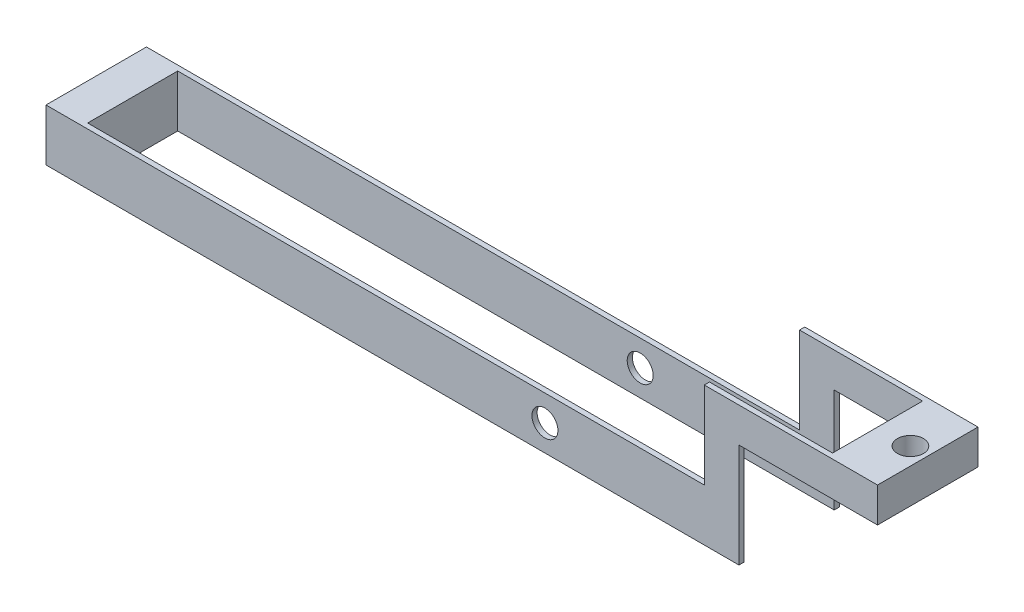
ISO-10303-21;
HEADER;
FILE_DESCRIPTION(('STEP AP214'),'2;1');
FILE_NAME('part.step','',(''),(''),'','','');
FILE_SCHEMA(('AUTOMOTIVE_DESIGN { 1 0 10303 214 1 1 1 1 }'));
ENDSEC;
DATA;
#1=APPLICATION_CONTEXT('core data for automotive mechanical design processes');
#2=APPLICATION_PROTOCOL_DEFINITION('international standard','automotive_design',2000,#1);
#3=PRODUCT_CONTEXT('',#1,'mechanical');
#4=PRODUCT('Part','Part','',(#3));
#5=PRODUCT_RELATED_PRODUCT_CATEGORY('part','',(#4));
#6=PRODUCT_DEFINITION_FORMATION('','',#4);
#7=PRODUCT_DEFINITION_CONTEXT('part definition',#1,'design');
#8=PRODUCT_DEFINITION('design','',#6,#7);
#9=PRODUCT_DEFINITION_SHAPE('','',#8);
#10=(LENGTH_UNIT() NAMED_UNIT(*) SI_UNIT(.MILLI.,.METRE.));
#11=(NAMED_UNIT(*) PLANE_ANGLE_UNIT() SI_UNIT($,.RADIAN.));
#12=(NAMED_UNIT(*) SI_UNIT($,.STERADIAN.) SOLID_ANGLE_UNIT());
#13=UNCERTAINTY_MEASURE_WITH_UNIT(LENGTH_MEASURE(1.E-05),#10,'distance_accuracy_value','');
#14=(GEOMETRIC_REPRESENTATION_CONTEXT(3) GLOBAL_UNCERTAINTY_ASSIGNED_CONTEXT((#13)) GLOBAL_UNIT_ASSIGNED_CONTEXT((#10,
#11,#12)) REPRESENTATION_CONTEXT('',''));
#15=CARTESIAN_POINT('',(0.,0.,0.));
#16=DIRECTION('',(0.,0.,1.));
#17=DIRECTION('',(1.,0.,0.));
#18=AXIS2_PLACEMENT_3D('',#15,#16,#17);
#19=CARTESIAN_POINT('',(241.3,0.,36.83));
#20=DIRECTION('',(-1.,0.,0.));
#21=DIRECTION('',(0.,0.,1.));
#22=AXIS2_PLACEMENT_3D('',#19,#20,#21);
#23=PLANE('',#22);
#24=DIRECTION('',(0.,1.,0.));
#25=VECTOR('',#24,1.);
#26=CARTESIAN_POINT('',(241.3,0.,34.925));
#27=LINE('',#26,#25);
#28=CARTESIAN_POINT('',(241.3,19.05,34.925));
#29=VERTEX_POINT('',#28);
#30=CARTESIAN_POINT('',(241.3,50.8,34.925));
#31=VERTEX_POINT('',#30);
#32=EDGE_CURVE('E202',#29,#31,#27,.T.);
#33=ORIENTED_EDGE('',*,*,#32,.F.);
#34=DIRECTION('',(0.,0.,-1.));
#35=VECTOR('',#34,1.);
#36=CARTESIAN_POINT('',(241.3,19.05,36.83));
#37=LINE('',#36,#35);
#38=CARTESIAN_POINT('',(241.3,19.05,36.83));
#39=VERTEX_POINT('',#38);
#40=EDGE_CURVE('E271',#39,#29,#37,.T.);
#41=ORIENTED_EDGE('',*,*,#40,.F.);
#42=DIRECTION('',(0.,1.,0.));
#43=VECTOR('',#42,1.);
#44=CARTESIAN_POINT('',(241.3,0.,36.83));
#45=LINE('',#44,#43);
#46=CARTESIAN_POINT('',(241.3,50.8,36.83));
#47=VERTEX_POINT('',#46);
#48=EDGE_CURVE('E216',#39,#47,#45,.T.);
#49=ORIENTED_EDGE('',*,*,#48,.T.);
#50=DIRECTION('',(0.,0.,-1.));
#51=VECTOR('',#50,1.);
#52=CARTESIAN_POINT('',(241.3,50.8,36.83));
#53=LINE('',#52,#51);
#54=EDGE_CURVE('E274',#47,#31,#53,.T.);
#55=ORIENTED_EDGE('',*,*,#54,.T.);
#56=EDGE_LOOP('',(#33,#41,#49,#55));
#57=FACE_BOUND('',#56,.T.);
#58=ADVANCED_FACE('F35',(#57),#23,.T.);
#59=CARTESIAN_POINT('',(254.,0.,36.83));
#60=DIRECTION('',(1.,0.,0.));
#61=DIRECTION('',(0.,0.,-1.));
#62=AXIS2_PLACEMENT_3D('',#59,#60,#61);
#63=PLANE('',#62);
#64=DIRECTION('',(0.,-1.,0.));
#65=VECTOR('',#64,1.);
#66=CARTESIAN_POINT('',(254.,0.,34.925));
#67=LINE('',#66,#65);
#68=CARTESIAN_POINT('',(254.,38.1,34.925));
#69=VERTEX_POINT('',#68);
#70=CARTESIAN_POINT('',(254.,0.,34.925));
#71=VERTEX_POINT('',#70);
#72=EDGE_CURVE('E195',#69,#71,#67,.T.);
#73=ORIENTED_EDGE('',*,*,#72,.F.);
#74=DIRECTION('',(0.,0.,-1.));
#75=VECTOR('',#74,1.);
#76=CARTESIAN_POINT('',(254.,38.1,36.83));
#77=LINE('',#76,#75);
#78=CARTESIAN_POINT('',(254.,38.1,36.83));
#79=VERTEX_POINT('',#78);
#80=EDGE_CURVE('E259',#79,#69,#77,.T.);
#81=ORIENTED_EDGE('',*,*,#80,.F.);
#82=DIRECTION('',(0.,-1.,0.));
#83=VECTOR('',#82,1.);
#84=CARTESIAN_POINT('',(254.,0.,36.83));
#85=LINE('',#84,#83);
#86=CARTESIAN_POINT('',(254.,0.,36.83));
#87=VERTEX_POINT('',#86);
#88=EDGE_CURVE('E227',#79,#87,#85,.T.);
#89=ORIENTED_EDGE('',*,*,#88,.T.);
#90=DIRECTION('',(0.,0.,-1.));
#91=VECTOR('',#90,1.);
#92=CARTESIAN_POINT('',(254.,0.,36.83));
#93=LINE('',#92,#91);
#94=EDGE_CURVE('E263',#87,#71,#93,.T.);
#95=ORIENTED_EDGE('',*,*,#94,.T.);
#96=EDGE_LOOP('',(#73,#81,#89,#95));
#97=FACE_BOUND('',#96,.T.);
#98=ADVANCED_FACE('F312',(#97),#63,.T.);
#99=CARTESIAN_POINT('',(182.88,9.525,36.83));
#100=DIRECTION('',(0.,0.,-1.));
#101=DIRECTION('',(-1.,0.,0.));
#102=AXIS2_PLACEMENT_3D('',#99,#100,#101);
#103=CYLINDRICAL_SURFACE('',#102,4.76250000000001);
#104=CARTESIAN_POINT('',(182.88,9.525,34.925));
#105=DIRECTION('',(0.,0.,1.));
#106=DIRECTION('',(1.,0.,0.));
#107=AXIS2_PLACEMENT_3D('',#104,#105,#106);
#108=CIRCLE('',#107,4.76250000000001);
#109=CARTESIAN_POINT('',(187.6425,9.525,34.925));
#110=VERTEX_POINT('',#109);
#111=EDGE_CURVE('E197',#110,#110,#108,.T.);
#112=ORIENTED_EDGE('',*,*,#111,.F.);
#113=EDGE_LOOP('',(#112));
#114=FACE_BOUND('',#113,.T.);
#115=CARTESIAN_POINT('',(182.88,9.525,36.83));
#116=DIRECTION('',(0.,0.,1.));
#117=DIRECTION('',(1.,0.,0.));
#118=AXIS2_PLACEMENT_3D('',#115,#116,#117);
#119=CIRCLE('',#118,4.76250000000001);
#120=CARTESIAN_POINT('',(187.6425,9.525,36.83));
#121=VERTEX_POINT('',#120);
#122=EDGE_CURVE('E207',#121,#121,#119,.T.);
#123=ORIENTED_EDGE('',*,*,#122,.T.);
#124=EDGE_LOOP('',(#123));
#125=FACE_BOUND('',#124,.T.);
#126=ADVANCED_FACE('F344',(#114,#125),#103,.F.);
#127=CARTESIAN_POINT('',(304.8,0.,36.83));
#128=DIRECTION('',(1.,0.,0.));
#129=DIRECTION('',(0.,0.,-1.));
#130=AXIS2_PLACEMENT_3D('',#127,#128,#129);
#131=PLANE('',#130);
#132=DIRECTION('',(0.,-1.,0.));
#133=VECTOR('',#132,1.);
#134=CARTESIAN_POINT('',(304.8,0.,0.));
#135=LINE('',#134,#133);
#136=CARTESIAN_POINT('',(304.8,50.8,0.));
#137=VERTEX_POINT('',#136);
#138=CARTESIAN_POINT('',(304.8,38.1,0.));
#139=VERTEX_POINT('',#138);
#140=EDGE_CURVE('E235',#137,#139,#135,.T.);
#141=ORIENTED_EDGE('',*,*,#140,.F.);
#142=DIRECTION('',(0.,0.,-1.));
#143=VECTOR('',#142,1.);
#144=CARTESIAN_POINT('',(304.8,50.8,36.83));
#145=LINE('',#144,#143);
#146=CARTESIAN_POINT('',(304.8,50.8,36.83));
#147=VERTEX_POINT('',#146);
#148=EDGE_CURVE('E277',#147,#137,#145,.T.);
#149=ORIENTED_EDGE('',*,*,#148,.F.);
#150=DIRECTION('',(0.,-1.,0.));
#151=VECTOR('',#150,1.);
#152=CARTESIAN_POINT('',(304.8,0.,36.83));
#153=LINE('',#152,#151);
#154=CARTESIAN_POINT('',(304.8,38.1,36.83));
#155=VERTEX_POINT('',#154);
#156=EDGE_CURVE('E210',#147,#155,#153,.T.);
#157=ORIENTED_EDGE('',*,*,#156,.T.);
#158=DIRECTION('',(0.,0.,-1.));
#159=VECTOR('',#158,1.);
#160=CARTESIAN_POINT('',(304.8,38.1,36.83));
#161=LINE('',#160,#159);
#162=EDGE_CURVE('E232',#155,#139,#161,.T.);
#163=ORIENTED_EDGE('',*,*,#162,.T.);
#164=EDGE_LOOP('',(#141,#149,#157,#163));
#165=FACE_BOUND('',#164,.T.);
#166=ADVANCED_FACE('F317',(#165),#131,.T.);
#167=CARTESIAN_POINT('',(0.,50.8,36.83));
#168=DIRECTION('',(0.,-1.,0.));
#169=DIRECTION('',(1.,0.,0.));
#170=AXIS2_PLACEMENT_3D('',#167,#168,#169);
#171=PLANE('',#170);
#172=CARTESIAN_POINT('',(298.45,50.8,18.415));
#173=DIRECTION('',(0.,1.,0.));
#174=DIRECTION('',(0.,0.,1.));
#175=AXIS2_PLACEMENT_3D('',#172,#173,#174);
#176=CIRCLE('',#175,4.76250000000001);
#177=CARTESIAN_POINT('',(298.45,50.8,23.1775));
#178=VERTEX_POINT('',#177);
#179=EDGE_CURVE('E177',#178,#178,#176,.T.);
#180=ORIENTED_EDGE('',*,*,#179,.F.);
#181=EDGE_LOOP('',(#180));
#182=FACE_BOUND('',#181,.T.);
#183=DIRECTION('',(0.,0.,1.));
#184=VECTOR('',#183,1.);
#185=CARTESIAN_POINT('',(286.401052357656,50.8,34.925));
#186=LINE('',#185,#184);
#187=CARTESIAN_POINT('',(286.401052357656,50.8,1.905));
#188=VERTEX_POINT('',#187);
#189=CARTESIAN_POINT('',(286.401052357656,50.8,34.925));
#190=VERTEX_POINT('',#189);
#191=EDGE_CURVE('E159',#188,#190,#186,.T.);
#192=ORIENTED_EDGE('',*,*,#191,.T.);
#193=DIRECTION('',(-1.,0.,0.));
#194=VECTOR('',#193,1.);
#195=CARTESIAN_POINT('',(13.3510523576561,50.8,34.925));
#196=LINE('',#195,#194);
#197=EDGE_CURVE('E165',#190,#31,#196,.T.);
#198=ORIENTED_EDGE('',*,*,#197,.T.);
#199=ORIENTED_EDGE('',*,*,#54,.F.);
#200=DIRECTION('',(-1.,0.,0.));
#201=VECTOR('',#200,1.);
#202=CARTESIAN_POINT('',(0.,50.8,36.83));
#203=LINE('',#202,#201);
#204=EDGE_CURVE('E214',#147,#47,#203,.T.);
#205=ORIENTED_EDGE('',*,*,#204,.F.);
#206=ORIENTED_EDGE('',*,*,#148,.T.);
#207=DIRECTION('',(-1.,0.,0.));
#208=VECTOR('',#207,1.);
#209=CARTESIAN_POINT('',(0.,50.8,0.));
#210=LINE('',#209,#208);
#211=CARTESIAN_POINT('',(241.3,50.8,0.));
#212=VERTEX_POINT('',#211);
#213=EDGE_CURVE('E238',#137,#212,#210,.T.);
#214=ORIENTED_EDGE('',*,*,#213,.T.);
#215=CARTESIAN_POINT('',(241.3,50.8,1.905));
#216=VERTEX_POINT('',#215);
#217=EDGE_CURVE('E170',#216,#212,#53,.T.);
#218=ORIENTED_EDGE('',*,*,#217,.F.);
#219=DIRECTION('',(1.,0.,0.));
#220=VECTOR('',#219,1.);
#221=CARTESIAN_POINT('',(13.3510523576561,50.8,1.905));
#222=LINE('',#221,#220);
#223=EDGE_CURVE('E151',#216,#188,#222,.T.);
#224=ORIENTED_EDGE('',*,*,#223,.T.);
#225=EDGE_LOOP('',(#192,#198,#199,#205,#206,#214,#218,#224));
#226=FACE_BOUND('',#225,.T.);
#227=ADVANCED_FACE('F168',(#182,#226),#171,.F.);
#228=DIRECTION('',(0.,-1.,0.));
#229=VECTOR('',#228,1.);
#230=CARTESIAN_POINT('',(241.3,0.,1.905));
#231=LINE('',#230,#229);
#232=CARTESIAN_POINT('',(241.3,19.05,1.905));
#233=VERTEX_POINT('',#232);
#234=EDGE_CURVE('E51',#216,#233,#231,.T.);
#235=ORIENTED_EDGE('',*,*,#234,.F.);
#236=ORIENTED_EDGE('',*,*,#217,.T.);
#237=DIRECTION('',(0.,1.,0.));
#238=VECTOR('',#237,1.);
#239=CARTESIAN_POINT('',(241.3,0.,0.));
#240=LINE('',#239,#238);
#241=CARTESIAN_POINT('',(241.3,19.05,0.));
#242=VERTEX_POINT('',#241);
#243=EDGE_CURVE('E240',#242,#212,#240,.T.);
#244=ORIENTED_EDGE('',*,*,#243,.F.);
#245=EDGE_CURVE('E270',#233,#242,#37,.T.);
#246=ORIENTED_EDGE('',*,*,#245,.F.);
#247=EDGE_LOOP('',(#235,#236,#244,#246));
#248=FACE_BOUND('',#247,.T.);
#249=ADVANCED_FACE('F325',(#248),#23,.T.);
#250=CARTESIAN_POINT('',(0.,19.05,36.83));
#251=DIRECTION('',(0.,1.,0.));
#252=DIRECTION('',(0.,0.,1.));
#253=AXIS2_PLACEMENT_3D('',#250,#251,#252);
#254=PLANE('',#253);
#255=DIRECTION('',(1.,0.,0.));
#256=VECTOR('',#255,1.);
#257=CARTESIAN_POINT('',(0.,19.05,34.925));
#258=LINE('',#257,#256);
#259=CARTESIAN_POINT('',(13.3510523576561,19.05,34.925));
#260=VERTEX_POINT('',#259);
#261=EDGE_CURVE('E200',#260,#29,#258,.T.);
#262=ORIENTED_EDGE('',*,*,#261,.F.);
#263=DIRECTION('',(0.,0.,1.));
#264=VECTOR('',#263,1.);
#265=CARTESIAN_POINT('',(13.3510523576561,19.05,36.83));
#266=LINE('',#265,#264);
#267=CARTESIAN_POINT('',(13.3510523576561,19.05,1.905));
#268=VERTEX_POINT('',#267);
#269=EDGE_CURVE('E204',#268,#260,#266,.T.);
#270=ORIENTED_EDGE('',*,*,#269,.F.);
#271=DIRECTION('',(-1.,0.,0.));
#272=VECTOR('',#271,1.);
#273=CARTESIAN_POINT('',(0.,19.05,1.905));
#274=LINE('',#273,#272);
#275=EDGE_CURVE('E192',#233,#268,#274,.T.);
#276=ORIENTED_EDGE('',*,*,#275,.F.);
#277=ORIENTED_EDGE('',*,*,#245,.T.);
#278=DIRECTION('',(1.,0.,0.));
#279=VECTOR('',#278,1.);
#280=CARTESIAN_POINT('',(0.,19.05,0.));
#281=LINE('',#280,#279);
#282=CARTESIAN_POINT('',(0.,19.05,0.));
#283=VERTEX_POINT('',#282);
#284=EDGE_CURVE('E243',#283,#242,#281,.T.);
#285=ORIENTED_EDGE('',*,*,#284,.F.);
#286=DIRECTION('',(0.,0.,-1.));
#287=VECTOR('',#286,1.);
#288=CARTESIAN_POINT('',(0.,19.05,36.83));
#289=LINE('',#288,#287);
#290=CARTESIAN_POINT('',(0.,19.05,36.83));
#291=VERTEX_POINT('',#290);
#292=EDGE_CURVE('E268',#291,#283,#289,.T.);
#293=ORIENTED_EDGE('',*,*,#292,.F.);
#294=DIRECTION('',(1.,0.,0.));
#295=VECTOR('',#294,1.);
#296=CARTESIAN_POINT('',(0.,19.05,36.83));
#297=LINE('',#296,#295);
#298=EDGE_CURVE('E219',#291,#39,#297,.T.);
#299=ORIENTED_EDGE('',*,*,#298,.T.);
#300=ORIENTED_EDGE('',*,*,#40,.T.);
#301=EDGE_LOOP('',(#262,#270,#276,#277,#285,#293,#299,#300));
#302=FACE_BOUND('',#301,.T.);
#303=ADVANCED_FACE('F299',(#302),#254,.T.);
#304=CARTESIAN_POINT('',(0.,0.,36.83));
#305=DIRECTION('',(-1.,0.,0.));
#306=DIRECTION('',(0.,0.,1.));
#307=AXIS2_PLACEMENT_3D('',#304,#305,#306);
#308=PLANE('',#307);
#309=DIRECTION('',(0.,1.,0.));
#310=VECTOR('',#309,1.);
#311=CARTESIAN_POINT('',(0.,0.,0.));
#312=LINE('',#311,#310);
#313=CARTESIAN_POINT('',(0.,0.,0.));
#314=VERTEX_POINT('',#313);
#315=EDGE_CURVE('E246',#314,#283,#312,.T.);
#316=ORIENTED_EDGE('',*,*,#315,.F.);
#317=DIRECTION('',(0.,0.,-1.));
#318=VECTOR('',#317,1.);
#319=CARTESIAN_POINT('',(0.,0.,36.83));
#320=LINE('',#319,#318);
#321=CARTESIAN_POINT('',(0.,0.,36.83));
#322=VERTEX_POINT('',#321);
#323=EDGE_CURVE('E266',#322,#314,#320,.T.);
#324=ORIENTED_EDGE('',*,*,#323,.F.);
#325=DIRECTION('',(0.,1.,0.));
#326=VECTOR('',#325,1.);
#327=CARTESIAN_POINT('',(0.,0.,36.83));
#328=LINE('',#327,#326);
#329=EDGE_CURVE('E222',#322,#291,#328,.T.);
#330=ORIENTED_EDGE('',*,*,#329,.T.);
#331=ORIENTED_EDGE('',*,*,#292,.T.);
#332=EDGE_LOOP('',(#316,#324,#330,#331));
#333=FACE_BOUND('',#332,.T.);
#334=ADVANCED_FACE('F303',(#333),#308,.T.);
#335=CARTESIAN_POINT('',(0.,0.,36.83));
#336=DIRECTION('',(0.,1.,0.));
#337=DIRECTION('',(0.,0.,1.));
#338=AXIS2_PLACEMENT_3D('',#335,#336,#337);
#339=PLANE('',#338);
#340=DIRECTION('',(0.,0.,-1.));
#341=VECTOR('',#340,1.);
#342=CARTESIAN_POINT('',(13.3510523576561,0.,34.925));
#343=LINE('',#342,#341);
#344=CARTESIAN_POINT('',(13.3510523576561,0.,34.925));
#345=VERTEX_POINT('',#344);
#346=CARTESIAN_POINT('',(13.3510523576561,0.,1.905));
#347=VERTEX_POINT('',#346);
#348=EDGE_CURVE('E180',#345,#347,#343,.T.);
#349=ORIENTED_EDGE('',*,*,#348,.F.);
#350=DIRECTION('',(-1.,0.,0.));
#351=VECTOR('',#350,1.);
#352=CARTESIAN_POINT('',(13.3510523576561,0.,34.925));
#353=LINE('',#352,#351);
#354=EDGE_CURVE('E171',#71,#345,#353,.T.);
#355=ORIENTED_EDGE('',*,*,#354,.F.);
#356=ORIENTED_EDGE('',*,*,#94,.F.);
#357=DIRECTION('',(1.,0.,0.));
#358=VECTOR('',#357,1.);
#359=CARTESIAN_POINT('',(0.,0.,36.83));
#360=LINE('',#359,#358);
#361=EDGE_CURVE('E225',#322,#87,#360,.T.);
#362=ORIENTED_EDGE('',*,*,#361,.F.);
#363=ORIENTED_EDGE('',*,*,#323,.T.);
#364=DIRECTION('',(1.,0.,0.));
#365=VECTOR('',#364,1.);
#366=CARTESIAN_POINT('',(0.,0.,0.));
#367=LINE('',#366,#365);
#368=CARTESIAN_POINT('',(254.,0.,0.));
#369=VERTEX_POINT('',#368);
#370=EDGE_CURVE('E249',#314,#369,#367,.T.);
#371=ORIENTED_EDGE('',*,*,#370,.T.);
#372=CARTESIAN_POINT('',(254.,0.,1.905));
#373=VERTEX_POINT('',#372);
#374=EDGE_CURVE('E262',#373,#369,#93,.T.);
#375=ORIENTED_EDGE('',*,*,#374,.F.);
#376=DIRECTION('',(1.,0.,0.));
#377=VECTOR('',#376,1.);
#378=CARTESIAN_POINT('',(13.3510523576561,0.,1.905));
#379=LINE('',#378,#377);
#380=EDGE_CURVE('E174',#347,#373,#379,.T.);
#381=ORIENTED_EDGE('',*,*,#380,.F.);
#382=EDGE_LOOP('',(#349,#355,#356,#362,#363,#371,#375,#381));
#383=FACE_BOUND('',#382,.T.);
#384=ADVANCED_FACE('F310',(#383),#339,.F.);
#385=DIRECTION('',(0.,1.,0.));
#386=VECTOR('',#385,1.);
#387=CARTESIAN_POINT('',(254.,0.,1.905));
#388=LINE('',#387,#386);
#389=CARTESIAN_POINT('',(254.,38.1,1.905));
#390=VERTEX_POINT('',#389);
#391=EDGE_CURVE('E58',#373,#390,#388,.T.);
#392=ORIENTED_EDGE('',*,*,#391,.F.);
#393=ORIENTED_EDGE('',*,*,#374,.T.);
#394=DIRECTION('',(0.,-1.,0.));
#395=VECTOR('',#394,1.);
#396=CARTESIAN_POINT('',(254.,0.,0.));
#397=LINE('',#396,#395);
#398=CARTESIAN_POINT('',(254.,38.1,0.));
#399=VERTEX_POINT('',#398);
#400=EDGE_CURVE('E252',#399,#369,#397,.T.);
#401=ORIENTED_EDGE('',*,*,#400,.F.);
#402=EDGE_CURVE('E258',#390,#399,#77,.T.);
#403=ORIENTED_EDGE('',*,*,#402,.F.);
#404=EDGE_LOOP('',(#392,#393,#401,#403));
#405=FACE_BOUND('',#404,.T.);
#406=ADVANCED_FACE('F334',(#405),#63,.T.);
#407=CARTESIAN_POINT('',(182.88,9.525,1.905));
#408=DIRECTION('',(0.,0.,-1.));
#409=DIRECTION('',(-1.,0.,0.));
#410=AXIS2_PLACEMENT_3D('',#407,#408,#409);
#411=CIRCLE('',#410,4.76250000000001);
#412=CARTESIAN_POINT('',(178.1175,9.525,1.905));
#413=VERTEX_POINT('',#412);
#414=EDGE_CURVE('E189',#413,#413,#411,.T.);
#415=ORIENTED_EDGE('',*,*,#414,.F.);
#416=EDGE_LOOP('',(#415));
#417=FACE_BOUND('',#416,.T.);
#418=CARTESIAN_POINT('',(182.88,9.525,0.));
#419=DIRECTION('',(0.,0.,1.));
#420=DIRECTION('',(1.,0.,0.));
#421=AXIS2_PLACEMENT_3D('',#418,#419,#420);
#422=CIRCLE('',#421,4.76250000000001);
#423=CARTESIAN_POINT('',(187.6425,9.525,0.));
#424=VERTEX_POINT('',#423);
#425=EDGE_CURVE('E206',#424,#424,#422,.T.);
#426=ORIENTED_EDGE('',*,*,#425,.F.);
#427=EDGE_LOOP('',(#426));
#428=FACE_BOUND('',#427,.T.);
#429=ADVANCED_FACE('F37',(#417,#428),#103,.F.);
#430=CARTESIAN_POINT('',(0.,38.1,36.83));
#431=DIRECTION('',(0.,1.,0.));
#432=DIRECTION('',(0.,0.,1.));
#433=AXIS2_PLACEMENT_3D('',#430,#431,#432);
#434=PLANE('',#433);
#435=CARTESIAN_POINT('',(298.45,38.1,18.415));
#436=DIRECTION('',(0.,1.,0.));
#437=DIRECTION('',(0.,0.,1.));
#438=AXIS2_PLACEMENT_3D('',#435,#436,#437);
#439=CIRCLE('',#438,4.76250000000001);
#440=CARTESIAN_POINT('',(298.45,38.1,23.1775));
#441=VERTEX_POINT('',#440);
#442=EDGE_CURVE('E39',#441,#441,#439,.T.);
#443=ORIENTED_EDGE('',*,*,#442,.T.);
#444=EDGE_LOOP('',(#443));
#445=FACE_BOUND('',#444,.T.);
#446=ORIENTED_EDGE('',*,*,#80,.T.);
#447=DIRECTION('',(1.,0.,0.));
#448=VECTOR('',#447,1.);
#449=CARTESIAN_POINT('',(0.,38.1,34.925));
#450=LINE('',#449,#448);
#451=CARTESIAN_POINT('',(286.401052357656,38.1,34.925));
#452=VERTEX_POINT('',#451);
#453=EDGE_CURVE('E11',#69,#452,#450,.T.);
#454=ORIENTED_EDGE('',*,*,#453,.T.);
#455=DIRECTION('',(0.,0.,-1.));
#456=VECTOR('',#455,1.);
#457=CARTESIAN_POINT('',(286.401052357656,38.1,36.83));
#458=LINE('',#457,#456);
#459=CARTESIAN_POINT('',(286.401052357656,38.1,1.905));
#460=VERTEX_POINT('',#459);
#461=EDGE_CURVE('E44',#452,#460,#458,.T.);
#462=ORIENTED_EDGE('',*,*,#461,.T.);
#463=DIRECTION('',(-1.,0.,0.));
#464=VECTOR('',#463,1.);
#465=CARTESIAN_POINT('',(0.,38.1,1.905));
#466=LINE('',#465,#464);
#467=EDGE_CURVE('E152',#460,#390,#466,.T.);
#468=ORIENTED_EDGE('',*,*,#467,.T.);
#469=ORIENTED_EDGE('',*,*,#402,.T.);
#470=DIRECTION('',(1.,0.,0.));
#471=VECTOR('',#470,1.);
#472=CARTESIAN_POINT('',(0.,38.1,0.));
#473=LINE('',#472,#471);
#474=EDGE_CURVE('E211',#399,#139,#473,.T.);
#475=ORIENTED_EDGE('',*,*,#474,.T.);
#476=ORIENTED_EDGE('',*,*,#162,.F.);
#477=DIRECTION('',(1.,0.,0.));
#478=VECTOR('',#477,1.);
#479=CARTESIAN_POINT('',(0.,38.1,36.83));
#480=LINE('',#479,#478);
#481=EDGE_CURVE('E230',#79,#155,#480,.T.);
#482=ORIENTED_EDGE('',*,*,#481,.F.);
#483=EDGE_LOOP('',(#446,#454,#462,#468,#469,#475,#476,#482));
#484=FACE_BOUND('',#483,.T.);
#485=ADVANCED_FACE('F281',(#445,#484),#434,.F.);
#486=CARTESIAN_POINT('',(0.,0.,36.83));
#487=DIRECTION('',(0.,0.,1.));
#488=DIRECTION('',(1.,0.,0.));
#489=AXIS2_PLACEMENT_3D('',#486,#487,#488);
#490=PLANE('',#489);
#491=ORIENTED_EDGE('',*,*,#122,.F.);
#492=EDGE_LOOP('',(#491));
#493=FACE_BOUND('',#492,.T.);
#494=ORIENTED_EDGE('',*,*,#156,.F.);
#495=ORIENTED_EDGE('',*,*,#204,.T.);
#496=ORIENTED_EDGE('',*,*,#48,.F.);
#497=ORIENTED_EDGE('',*,*,#298,.F.);
#498=ORIENTED_EDGE('',*,*,#329,.F.);
#499=ORIENTED_EDGE('',*,*,#361,.T.);
#500=ORIENTED_EDGE('',*,*,#88,.F.);
#501=ORIENTED_EDGE('',*,*,#481,.T.);
#502=EDGE_LOOP('',(#494,#495,#496,#497,#498,#499,#500,#501));
#503=FACE_BOUND('',#502,.T.);
#504=ADVANCED_FACE('F295',(#493,#503),#490,.T.);
#505=CARTESIAN_POINT('',(0.,0.,0.));
#506=DIRECTION('',(0.,0.,1.));
#507=DIRECTION('',(1.,0.,0.));
#508=AXIS2_PLACEMENT_3D('',#505,#506,#507);
#509=PLANE('',#508);
#510=ORIENTED_EDGE('',*,*,#425,.T.);
#511=EDGE_LOOP('',(#510));
#512=FACE_BOUND('',#511,.T.);
#513=ORIENTED_EDGE('',*,*,#140,.T.);
#514=ORIENTED_EDGE('',*,*,#474,.F.);
#515=ORIENTED_EDGE('',*,*,#400,.T.);
#516=ORIENTED_EDGE('',*,*,#370,.F.);
#517=ORIENTED_EDGE('',*,*,#315,.T.);
#518=ORIENTED_EDGE('',*,*,#284,.T.);
#519=ORIENTED_EDGE('',*,*,#243,.T.);
#520=ORIENTED_EDGE('',*,*,#213,.F.);
#521=EDGE_LOOP('',(#513,#514,#515,#516,#517,#518,#519,#520));
#522=FACE_BOUND('',#521,.T.);
#523=ADVANCED_FACE('F320',(#512,#522),#509,.F.);
#524=CARTESIAN_POINT('',(286.401052357656,50.8,34.925));
#525=DIRECTION('',(1.,0.,0.));
#526=DIRECTION('',(0.,0.,-1.));
#527=AXIS2_PLACEMENT_3D('',#524,#525,#526);
#528=PLANE('',#527);
#529=DIRECTION('',(0.,-1.,0.));
#530=VECTOR('',#529,1.);
#531=CARTESIAN_POINT('',(286.401052357656,50.8,34.925));
#532=LINE('',#531,#530);
#533=EDGE_CURVE('E155',#190,#452,#532,.T.);
#534=ORIENTED_EDGE('',*,*,#533,.F.);
#535=ORIENTED_EDGE('',*,*,#191,.F.);
#536=DIRECTION('',(0.,-1.,0.));
#537=VECTOR('',#536,1.);
#538=CARTESIAN_POINT('',(286.401052357656,50.8,1.905));
#539=LINE('',#538,#537);
#540=EDGE_CURVE('E146',#188,#460,#539,.T.);
#541=ORIENTED_EDGE('',*,*,#540,.T.);
#542=ORIENTED_EDGE('',*,*,#461,.F.);
#543=EDGE_LOOP('',(#534,#535,#541,#542));
#544=FACE_BOUND('',#543,.T.);
#545=ADVANCED_FACE('F160',(#544),#528,.F.);
#546=CARTESIAN_POINT('',(13.3510523576561,50.8,34.925));
#547=DIRECTION('',(-1.,0.,0.));
#548=DIRECTION('',(0.,0.,1.));
#549=AXIS2_PLACEMENT_3D('',#546,#547,#548);
#550=PLANE('',#549);
#551=ORIENTED_EDGE('',*,*,#269,.T.);
#552=DIRECTION('',(0.,-1.,0.));
#553=VECTOR('',#552,1.);
#554=CARTESIAN_POINT('',(13.3510523576561,50.8,34.925));
#555=LINE('',#554,#553);
#556=EDGE_CURVE('E184',#260,#345,#555,.T.);
#557=ORIENTED_EDGE('',*,*,#556,.T.);
#558=ORIENTED_EDGE('',*,*,#348,.T.);
#559=DIRECTION('',(0.,-1.,0.));
#560=VECTOR('',#559,1.);
#561=CARTESIAN_POINT('',(13.3510523576561,50.8,1.905));
#562=LINE('',#561,#560);
#563=EDGE_CURVE('E156',#268,#347,#562,.T.);
#564=ORIENTED_EDGE('',*,*,#563,.F.);
#565=EDGE_LOOP('',(#551,#557,#558,#564));
#566=FACE_BOUND('',#565,.T.);
#567=ADVANCED_FACE('F329',(#566),#550,.F.);
#568=CARTESIAN_POINT('',(13.3510523576561,50.8,34.925));
#569=DIRECTION('',(0.,0.,1.));
#570=DIRECTION('',(1.,0.,0.));
#571=AXIS2_PLACEMENT_3D('',#568,#569,#570);
#572=PLANE('',#571);
#573=ORIENTED_EDGE('',*,*,#32,.T.);
#574=ORIENTED_EDGE('',*,*,#197,.F.);
#575=ORIENTED_EDGE('',*,*,#533,.T.);
#576=ORIENTED_EDGE('',*,*,#453,.F.);
#577=ORIENTED_EDGE('',*,*,#72,.T.);
#578=ORIENTED_EDGE('',*,*,#354,.T.);
#579=ORIENTED_EDGE('',*,*,#556,.F.);
#580=ORIENTED_EDGE('',*,*,#261,.T.);
#581=EDGE_LOOP('',(#573,#574,#575,#576,#577,#578,#579,#580));
#582=FACE_BOUND('',#581,.T.);
#583=ORIENTED_EDGE('',*,*,#111,.T.);
#584=EDGE_LOOP('',(#583));
#585=FACE_BOUND('',#584,.T.);
#586=ADVANCED_FACE('F284',(#582,#585),#572,.F.);
#587=CARTESIAN_POINT('',(13.3510523576561,50.8,1.905));
#588=DIRECTION('',(0.,0.,-1.));
#589=DIRECTION('',(-1.,0.,0.));
#590=AXIS2_PLACEMENT_3D('',#587,#588,#589);
#591=PLANE('',#590);
#592=ORIENTED_EDGE('',*,*,#234,.T.);
#593=ORIENTED_EDGE('',*,*,#275,.T.);
#594=ORIENTED_EDGE('',*,*,#563,.T.);
#595=ORIENTED_EDGE('',*,*,#380,.T.);
#596=ORIENTED_EDGE('',*,*,#391,.T.);
#597=ORIENTED_EDGE('',*,*,#467,.F.);
#598=ORIENTED_EDGE('',*,*,#540,.F.);
#599=ORIENTED_EDGE('',*,*,#223,.F.);
#600=EDGE_LOOP('',(#592,#593,#594,#595,#596,#597,#598,#599));
#601=FACE_BOUND('',#600,.T.);
#602=ORIENTED_EDGE('',*,*,#414,.T.);
#603=EDGE_LOOP('',(#602));
#604=FACE_BOUND('',#603,.T.);
#605=ADVANCED_FACE('F148',(#601,#604),#591,.F.);
#606=CARTESIAN_POINT('',(298.45,0.,18.415));
#607=DIRECTION('',(0.,1.,0.));
#608=DIRECTION('',(0.,0.,1.));
#609=AXIS2_PLACEMENT_3D('',#606,#607,#608);
#610=CYLINDRICAL_SURFACE('',#609,4.76250000000001);
#611=ORIENTED_EDGE('',*,*,#179,.T.);
#612=EDGE_LOOP('',(#611));
#613=FACE_BOUND('',#612,.T.);
#614=ORIENTED_EDGE('',*,*,#442,.F.);
#615=EDGE_LOOP('',(#614));
#616=FACE_BOUND('',#615,.T.);
#617=ADVANCED_FACE('F370',(#613,#616),#610,.F.);
#618=CLOSED_SHELL('',(#58,#98,#126,#166,#227,#249,#303,#334,#384,#406,#429,#485,#504,#523,#545,
#567,#586,#605,#617));
#619=MANIFOLD_SOLID_BREP('B2',#618);
#620=ADVANCED_BREP_SHAPE_REPRESENTATION('',(#18,#619),#14);
#621=SHAPE_DEFINITION_REPRESENTATION(#9,#620);
ENDSEC;
END-ISO-10303-21;
